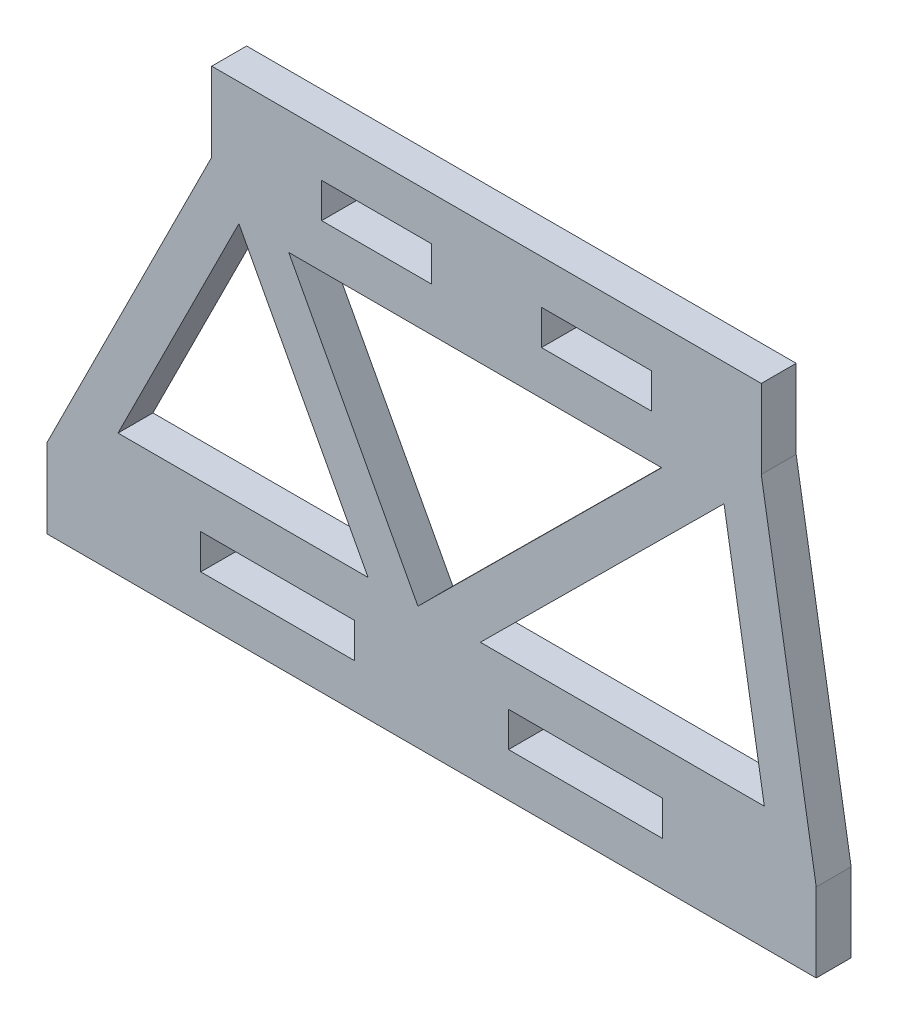
ISO-10303-21;
HEADER;
FILE_DESCRIPTION(('STEP AP214'),'2;1');
FILE_NAME('part.step','',(''),(''),'','','');
FILE_SCHEMA(('AUTOMOTIVE_DESIGN { 1 0 10303 214 1 1 1 1 }'));
ENDSEC;
DATA;
#1=APPLICATION_CONTEXT('core data for automotive mechanical design processes');
#2=APPLICATION_PROTOCOL_DEFINITION('international standard','automotive_design',2000,#1);
#3=PRODUCT_CONTEXT('',#1,'mechanical');
#4=PRODUCT('Part','Part','',(#3));
#5=PRODUCT_RELATED_PRODUCT_CATEGORY('part','',(#4));
#6=PRODUCT_DEFINITION_FORMATION('','',#4);
#7=PRODUCT_DEFINITION_CONTEXT('part definition',#1,'design');
#8=PRODUCT_DEFINITION('design','',#6,#7);
#9=PRODUCT_DEFINITION_SHAPE('','',#8);
#10=(LENGTH_UNIT() NAMED_UNIT(*) SI_UNIT(.MILLI.,.METRE.));
#11=(NAMED_UNIT(*) PLANE_ANGLE_UNIT() SI_UNIT($,.RADIAN.));
#12=(NAMED_UNIT(*) SI_UNIT($,.STERADIAN.) SOLID_ANGLE_UNIT());
#13=UNCERTAINTY_MEASURE_WITH_UNIT(LENGTH_MEASURE(1.E-05),#10,'distance_accuracy_value','');
#14=(GEOMETRIC_REPRESENTATION_CONTEXT(3) GLOBAL_UNCERTAINTY_ASSIGNED_CONTEXT((#13)) GLOBAL_UNIT_ASSIGNED_CONTEXT((#10,
#11,#12)) REPRESENTATION_CONTEXT('',''));
#15=CARTESIAN_POINT('',(0.,0.,0.));
#16=DIRECTION('',(0.,0.,1.));
#17=DIRECTION('',(1.,0.,0.));
#18=AXIS2_PLACEMENT_3D('',#15,#16,#17);
#19=CARTESIAN_POINT('',(0.,0.,3.175));
#20=DIRECTION('',(0.,0.,1.));
#21=DIRECTION('',(1.,0.,0.));
#22=AXIS2_PLACEMENT_3D('',#19,#20,#21);
#23=PLANE('',#22);
#24=DIRECTION('',(0.,-1.,0.));
#25=VECTOR('',#24,1.);
#26=CARTESIAN_POINT('',(0.,0.,3.175));
#27=LINE('',#26,#25);
#28=CARTESIAN_POINT('',(0.,0.,3.175));
#29=VERTEX_POINT('',#28);
#30=CARTESIAN_POINT('',(0.,-7.17499999999999,3.175));
#31=VERTEX_POINT('',#30);
#32=EDGE_CURVE('E452',#29,#31,#27,.T.);
#33=ORIENTED_EDGE('',*,*,#32,.T.);
#34=DIRECTION('',(1.,0.,0.));
#35=VECTOR('',#34,1.);
#36=CARTESIAN_POINT('',(0.,-7.17499999999999,3.175));
#37=LINE('',#36,#35);
#38=CARTESIAN_POINT('',(70.,-7.17499999999999,3.175));
#39=VERTEX_POINT('',#38);
#40=EDGE_CURVE('E455',#31,#39,#37,.T.);
#41=ORIENTED_EDGE('',*,*,#40,.T.);
#42=DIRECTION('',(0.,1.,0.));
#43=VECTOR('',#42,1.);
#44=CARTESIAN_POINT('',(70.,-7.17499999999999,3.175));
#45=LINE('',#44,#43);
#46=CARTESIAN_POINT('',(70.,0.,3.175));
#47=VERTEX_POINT('',#46);
#48=EDGE_CURVE('E458',#39,#47,#45,.T.);
#49=ORIENTED_EDGE('',*,*,#48,.T.);
#50=DIRECTION('',(-0.164398987305357,0.986393923832144,0.));
#51=VECTOR('',#50,1.);
#52=CARTESIAN_POINT('',(65.,30.,3.175));
#53=LINE('',#52,#51);
#54=CARTESIAN_POINT('',(65.,30.,3.175));
#55=VERTEX_POINT('',#54);
#56=EDGE_CURVE('E460',#47,#55,#53,.T.);
#57=ORIENTED_EDGE('',*,*,#56,.T.);
#58=DIRECTION('',(0.,1.,0.));
#59=VECTOR('',#58,1.);
#60=CARTESIAN_POINT('',(65.,37.175,3.175));
#61=LINE('',#60,#59);
#62=CARTESIAN_POINT('',(65.,37.175,3.175));
#63=VERTEX_POINT('',#62);
#64=EDGE_CURVE('E462',#55,#63,#61,.T.);
#65=ORIENTED_EDGE('',*,*,#64,.T.);
#66=DIRECTION('',(-1.,0.,0.));
#67=VECTOR('',#66,1.);
#68=CARTESIAN_POINT('',(15.,37.175,3.175));
#69=LINE('',#68,#67);
#70=CARTESIAN_POINT('',(15.,37.175,3.175));
#71=VERTEX_POINT('',#70);
#72=EDGE_CURVE('E464',#63,#71,#69,.T.);
#73=ORIENTED_EDGE('',*,*,#72,.T.);
#74=DIRECTION('',(0.,-1.,0.));
#75=VECTOR('',#74,1.);
#76=CARTESIAN_POINT('',(15.,30.,3.175));
#77=LINE('',#76,#75);
#78=CARTESIAN_POINT('',(15.,30.,3.175));
#79=VERTEX_POINT('',#78);
#80=EDGE_CURVE('E466',#71,#79,#77,.T.);
#81=ORIENTED_EDGE('',*,*,#80,.T.);
#82=DIRECTION('',(-0.447213595499958,-0.894427190999916,0.));
#83=VECTOR('',#82,1.);
#84=CARTESIAN_POINT('',(15.,30.,3.175));
#85=LINE('',#84,#83);
#86=EDGE_CURVE('E468',#79,#29,#85,.T.);
#87=ORIENTED_EDGE('',*,*,#86,.T.);
#88=EDGE_LOOP('',(#33,#41,#49,#57,#65,#73,#81,#87));
#89=FACE_BOUND('',#88,.T.);
#90=DIRECTION('',(0.,1.,0.));
#91=VECTOR('',#90,1.);
#92=CARTESIAN_POINT('',(35.,33.175,3.175));
#93=LINE('',#92,#91);
#94=CARTESIAN_POINT('',(35.,30.,3.175));
#95=VERTEX_POINT('',#94);
#96=CARTESIAN_POINT('',(35.,33.175,3.175));
#97=VERTEX_POINT('',#96);
#98=EDGE_CURVE('E423',#95,#97,#93,.T.);
#99=ORIENTED_EDGE('',*,*,#98,.F.);
#100=DIRECTION('',(1.,0.,0.));
#101=VECTOR('',#100,1.);
#102=CARTESIAN_POINT('',(25.,30.,3.175));
#103=LINE('',#102,#101);
#104=CARTESIAN_POINT('',(25.,30.,3.175));
#105=VERTEX_POINT('',#104);
#106=EDGE_CURVE('E421',#105,#95,#103,.T.);
#107=ORIENTED_EDGE('',*,*,#106,.F.);
#108=DIRECTION('',(0.,-1.,0.));
#109=VECTOR('',#108,1.);
#110=CARTESIAN_POINT('',(25.,30.,3.175));
#111=LINE('',#110,#109);
#112=CARTESIAN_POINT('',(25.,33.175,3.175));
#113=VERTEX_POINT('',#112);
#114=EDGE_CURVE('E429',#113,#105,#111,.T.);
#115=ORIENTED_EDGE('',*,*,#114,.F.);
#116=DIRECTION('',(-1.,0.,0.));
#117=VECTOR('',#116,1.);
#118=CARTESIAN_POINT('',(25.,33.175,3.175));
#119=LINE('',#118,#117);
#120=EDGE_CURVE('E426',#97,#113,#119,.T.);
#121=ORIENTED_EDGE('',*,*,#120,.F.);
#122=EDGE_LOOP('',(#99,#107,#115,#121));
#123=FACE_BOUND('',#122,.T.);
#124=DIRECTION('',(0.,-1.,0.));
#125=VECTOR('',#124,1.);
#126=CARTESIAN_POINT('',(14.,1.95522954975216E-13,3.175));
#127=LINE('',#126,#125);
#128=CARTESIAN_POINT('',(14.,1.95522954975216E-13,3.175));
#129=VERTEX_POINT('',#128);
#130=CARTESIAN_POINT('',(14.,-3.1749999999998,3.175));
#131=VERTEX_POINT('',#130);
#132=EDGE_CURVE('E392',#129,#131,#127,.T.);
#133=ORIENTED_EDGE('',*,*,#132,.F.);
#134=DIRECTION('',(-1.,0.,0.));
#135=VECTOR('',#134,1.);
#136=CARTESIAN_POINT('',(28.,3.90891042079233E-13,3.175));
#137=LINE('',#136,#135);
#138=CARTESIAN_POINT('',(28.,3.90891042079233E-13,3.175));
#139=VERTEX_POINT('',#138);
#140=EDGE_CURVE('E390',#139,#129,#137,.T.);
#141=ORIENTED_EDGE('',*,*,#140,.F.);
#142=DIRECTION('',(0.,1.,0.));
#143=VECTOR('',#142,1.);
#144=CARTESIAN_POINT('',(28.,-3.17499999999961,3.175));
#145=LINE('',#144,#143);
#146=CARTESIAN_POINT('',(28.,-3.17499999999961,3.175));
#147=VERTEX_POINT('',#146);
#148=EDGE_CURVE('E398',#147,#139,#145,.T.);
#149=ORIENTED_EDGE('',*,*,#148,.F.);
#150=DIRECTION('',(1.,0.,0.));
#151=VECTOR('',#150,1.);
#152=CARTESIAN_POINT('',(14.,-3.1749999999998,3.175));
#153=LINE('',#152,#151);
#154=EDGE_CURVE('E395',#131,#147,#153,.T.);
#155=ORIENTED_EDGE('',*,*,#154,.F.);
#156=EDGE_LOOP('',(#133,#141,#149,#155));
#157=FACE_BOUND('',#156,.T.);
#158=DIRECTION('',(0.,-1.,0.));
#159=VECTOR('',#158,1.);
#160=CARTESIAN_POINT('',(42.,5.86568864925647E-13,3.175));
#161=LINE('',#160,#159);
#162=CARTESIAN_POINT('',(42.,5.86568864925647E-13,3.175));
#163=VERTEX_POINT('',#162);
#164=CARTESIAN_POINT('',(42.,-3.17499999999941,3.175));
#165=VERTEX_POINT('',#164);
#166=EDGE_CURVE('E361',#163,#165,#161,.T.);
#167=ORIENTED_EDGE('',*,*,#166,.F.);
#168=DIRECTION('',(-1.,0.,0.));
#169=VECTOR('',#168,1.);
#170=CARTESIAN_POINT('',(56.,4.03188974282269E-13,3.175));
#171=LINE('',#170,#169);
#172=CARTESIAN_POINT('',(56.,4.03188974282269E-13,3.175));
#173=VERTEX_POINT('',#172);
#174=EDGE_CURVE('E359',#173,#163,#171,.T.);
#175=ORIENTED_EDGE('',*,*,#174,.F.);
#176=DIRECTION('',(0.,1.,0.));
#177=VECTOR('',#176,1.);
#178=CARTESIAN_POINT('',(56.,-3.1749999999996,3.175));
#179=LINE('',#178,#177);
#180=CARTESIAN_POINT('',(56.,-3.1749999999996,3.175));
#181=VERTEX_POINT('',#180);
#182=EDGE_CURVE('E367',#181,#173,#179,.T.);
#183=ORIENTED_EDGE('',*,*,#182,.F.);
#184=DIRECTION('',(1.,0.,0.));
#185=VECTOR('',#184,1.);
#186=CARTESIAN_POINT('',(42.,-3.17499999999941,3.175));
#187=LINE('',#186,#185);
#188=EDGE_CURVE('E364',#165,#181,#187,.T.);
#189=ORIENTED_EDGE('',*,*,#188,.F.);
#190=EDGE_LOOP('',(#167,#175,#183,#189));
#191=FACE_BOUND('',#190,.T.);
#192=DIRECTION('',(0.,1.,0.));
#193=VECTOR('',#192,1.);
#194=CARTESIAN_POINT('',(55.,33.175,3.175));
#195=LINE('',#194,#193);
#196=CARTESIAN_POINT('',(55.,30.,3.175));
#197=VERTEX_POINT('',#196);
#198=CARTESIAN_POINT('',(55.,33.175,3.175));
#199=VERTEX_POINT('',#198);
#200=EDGE_CURVE('E330',#197,#199,#195,.T.);
#201=ORIENTED_EDGE('',*,*,#200,.F.);
#202=DIRECTION('',(1.,0.,0.));
#203=VECTOR('',#202,1.);
#204=CARTESIAN_POINT('',(45.,30.,3.175));
#205=LINE('',#204,#203);
#206=CARTESIAN_POINT('',(45.,30.,3.175));
#207=VERTEX_POINT('',#206);
#208=EDGE_CURVE('E328',#207,#197,#205,.T.);
#209=ORIENTED_EDGE('',*,*,#208,.F.);
#210=DIRECTION('',(0.,-1.,0.));
#211=VECTOR('',#210,1.);
#212=CARTESIAN_POINT('',(45.,30.,3.175));
#213=LINE('',#212,#211);
#214=CARTESIAN_POINT('',(45.,33.175,3.175));
#215=VERTEX_POINT('',#214);
#216=EDGE_CURVE('E336',#215,#207,#213,.T.);
#217=ORIENTED_EDGE('',*,*,#216,.F.);
#218=DIRECTION('',(-1.,0.,0.));
#219=VECTOR('',#218,1.);
#220=CARTESIAN_POINT('',(45.,33.175,3.175));
#221=LINE('',#220,#219);
#222=EDGE_CURVE('E333',#199,#215,#221,.T.);
#223=ORIENTED_EDGE('',*,*,#222,.F.);
#224=EDGE_LOOP('',(#201,#209,#217,#223));
#225=FACE_BOUND('',#224,.T.);
#226=DIRECTION('',(1.,0.,0.));
#227=VECTOR('',#226,1.);
#228=CARTESIAN_POINT('',(65.2781583131345,4.0000000000004,3.175));
#229=LINE('',#228,#227);
#230=CARTESIAN_POINT('',(39.4403763011618,4.0000000000004,3.175));
#231=VERTEX_POINT('',#230);
#232=CARTESIAN_POINT('',(65.2781583131344,4.00000000000041,3.175));
#233=VERTEX_POINT('',#232);
#234=EDGE_CURVE('E303',#231,#233,#229,.T.);
#235=ORIENTED_EDGE('',*,*,#234,.F.);
#236=DIRECTION('',(-0.709840729579017,-0.704362221183624,0.));
#237=VECTOR('',#236,1.);
#238=CARTESIAN_POINT('',(39.4403763011618,4.0000000000004,3.175));
#239=LINE('',#238,#237);
#240=CARTESIAN_POINT('',(61.6114916464679,26.,3.175));
#241=VERTEX_POINT('',#240);
#242=EDGE_CURVE('E305',#241,#231,#239,.T.);
#243=ORIENTED_EDGE('',*,*,#242,.F.);
#244=DIRECTION('',(-0.164398987305357,0.986393923832144,0.));
#245=VECTOR('',#244,1.);
#246=CARTESIAN_POINT('',(61.6114916464679,26.,3.175));
#247=LINE('',#246,#245);
#248=EDGE_CURVE('E324',#233,#241,#247,.T.);
#249=ORIENTED_EDGE('',*,*,#248,.F.);
#250=EDGE_LOOP('',(#235,#243,#249));
#251=FACE_BOUND('',#250,.T.);
#252=DIRECTION('',(-0.447213595499958,-0.894427190999916,0.));
#253=VECTOR('',#252,1.);
#254=CARTESIAN_POINT('',(17.4721359549996,26.,3.175));
#255=LINE('',#254,#253);
#256=CARTESIAN_POINT('',(17.4721359549996,26.,3.175));
#257=VERTEX_POINT('',#256);
#258=CARTESIAN_POINT('',(6.47213595499978,4.0000000000004,3.175));
#259=VERTEX_POINT('',#258);
#260=EDGE_CURVE('E58',#257,#259,#255,.T.);
#261=ORIENTED_EDGE('',*,*,#260,.F.);
#262=DIRECTION('',(-0.471240107527781,0.882004966571734,0.));
#263=VECTOR('',#262,1.);
#264=CARTESIAN_POINT('',(29.2263581629624,4.0000000000004,3.175));
#265=LINE('',#264,#263);
#266=CARTESIAN_POINT('',(29.2263581629624,4.0000000000004,3.175));
#267=VERTEX_POINT('',#266);
#268=EDGE_CURVE('E254',#267,#257,#265,.T.);
#269=ORIENTED_EDGE('',*,*,#268,.F.);
#270=DIRECTION('',(1.,0.,0.));
#271=VECTOR('',#270,1.);
#272=CARTESIAN_POINT('',(6.47213595499978,4.0000000000004,3.175));
#273=LINE('',#272,#271);
#274=EDGE_CURVE('E264',#259,#267,#273,.T.);
#275=ORIENTED_EDGE('',*,*,#274,.F.);
#276=EDGE_LOOP('',(#261,#269,#275));
#277=FACE_BOUND('',#276,.T.);
#278=DIRECTION('',(0.471240107527781,-0.882004966571734,0.));
#279=VECTOR('',#278,1.);
#280=CARTESIAN_POINT('',(33.7614800178286,4.0000000000004,3.175));
#281=LINE('',#280,#279);
#282=CARTESIAN_POINT('',(22.0072578098658,26.,3.175));
#283=VERTEX_POINT('',#282);
#284=CARTESIAN_POINT('',(33.7614800178286,4.0000000000004,3.175));
#285=VERTEX_POINT('',#284);
#286=EDGE_CURVE('E50',#283,#285,#281,.T.);
#287=ORIENTED_EDGE('',*,*,#286,.F.);
#288=DIRECTION('',(-1.,0.,0.));
#289=VECTOR('',#288,1.);
#290=CARTESIAN_POINT('',(22.0072578098658,26.,3.175));
#291=LINE('',#290,#289);
#292=CARTESIAN_POINT('',(55.9325953631347,26.,3.175));
#293=VERTEX_POINT('',#292);
#294=EDGE_CURVE('E281',#293,#283,#291,.T.);
#295=ORIENTED_EDGE('',*,*,#294,.F.);
#296=DIRECTION('',(0.709840729579017,0.704362221183624,0.));
#297=VECTOR('',#296,1.);
#298=CARTESIAN_POINT('',(55.9325953631347,26.,3.175));
#299=LINE('',#298,#297);
#300=EDGE_CURVE('E300',#285,#293,#299,.T.);
#301=ORIENTED_EDGE('',*,*,#300,.F.);
#302=EDGE_LOOP('',(#287,#295,#301));
#303=FACE_BOUND('',#302,.T.);
#304=ADVANCED_FACE('F35',(#89,#123,#157,#191,#225,#251,#277,#303),#23,.T.);
#305=CARTESIAN_POINT('',(0.,0.,0.));
#306=DIRECTION('',(0.,0.,1.));
#307=DIRECTION('',(1.,0.,0.));
#308=AXIS2_PLACEMENT_3D('',#305,#306,#307);
#309=PLANE('',#308);
#310=DIRECTION('',(-0.471240107527781,0.882004966571734,0.));
#311=VECTOR('',#310,1.);
#312=CARTESIAN_POINT('',(29.2263581629624,4.0000000000004,0.));
#313=LINE('',#312,#311);
#314=CARTESIAN_POINT('',(29.2263581629624,4.0000000000004,0.));
#315=VERTEX_POINT('',#314);
#316=CARTESIAN_POINT('',(17.4721359549996,26.,0.));
#317=VERTEX_POINT('',#316);
#318=EDGE_CURVE('E256',#315,#317,#313,.T.);
#319=ORIENTED_EDGE('',*,*,#318,.T.);
#320=DIRECTION('',(-0.447213595499958,-0.894427190999916,0.));
#321=VECTOR('',#320,1.);
#322=CARTESIAN_POINT('',(17.4721359549996,26.,0.));
#323=LINE('',#322,#321);
#324=CARTESIAN_POINT('',(6.47213595499978,4.0000000000004,0.));
#325=VERTEX_POINT('',#324);
#326=EDGE_CURVE('E271',#317,#325,#323,.T.);
#327=ORIENTED_EDGE('',*,*,#326,.T.);
#328=DIRECTION('',(1.,0.,0.));
#329=VECTOR('',#328,1.);
#330=CARTESIAN_POINT('',(6.47213595499978,4.0000000000004,0.));
#331=LINE('',#330,#329);
#332=EDGE_CURVE('E261',#325,#315,#331,.T.);
#333=ORIENTED_EDGE('',*,*,#332,.T.);
#334=EDGE_LOOP('',(#319,#327,#333));
#335=FACE_BOUND('',#334,.T.);
#336=DIRECTION('',(1.,0.,0.));
#337=VECTOR('',#336,1.);
#338=CARTESIAN_POINT('',(45.,30.,0.));
#339=LINE('',#338,#337);
#340=CARTESIAN_POINT('',(45.,30.,0.));
#341=VERTEX_POINT('',#340);
#342=CARTESIAN_POINT('',(55.,30.,0.));
#343=VERTEX_POINT('',#342);
#344=EDGE_CURVE('E327',#341,#343,#339,.T.);
#345=ORIENTED_EDGE('',*,*,#344,.T.);
#346=DIRECTION('',(0.,1.,0.));
#347=VECTOR('',#346,1.);
#348=CARTESIAN_POINT('',(55.,33.175,0.));
#349=LINE('',#348,#347);
#350=CARTESIAN_POINT('',(55.,33.175,0.));
#351=VERTEX_POINT('',#350);
#352=EDGE_CURVE('E341',#343,#351,#349,.T.);
#353=ORIENTED_EDGE('',*,*,#352,.T.);
#354=DIRECTION('',(-1.,0.,0.));
#355=VECTOR('',#354,1.);
#356=CARTESIAN_POINT('',(45.,33.175,0.));
#357=LINE('',#356,#355);
#358=CARTESIAN_POINT('',(45.,33.175,0.));
#359=VERTEX_POINT('',#358);
#360=EDGE_CURVE('E344',#351,#359,#357,.T.);
#361=ORIENTED_EDGE('',*,*,#360,.T.);
#362=DIRECTION('',(0.,-1.,0.));
#363=VECTOR('',#362,1.);
#364=CARTESIAN_POINT('',(45.,30.,0.));
#365=LINE('',#364,#363);
#366=EDGE_CURVE('E331',#359,#341,#365,.T.);
#367=ORIENTED_EDGE('',*,*,#366,.T.);
#368=EDGE_LOOP('',(#345,#353,#361,#367));
#369=FACE_BOUND('',#368,.T.);
#370=DIRECTION('',(-1.,0.,0.));
#371=VECTOR('',#370,1.);
#372=CARTESIAN_POINT('',(28.,3.90891042079233E-13,0.));
#373=LINE('',#372,#371);
#374=CARTESIAN_POINT('',(28.,3.90891038659408E-13,0.));
#375=VERTEX_POINT('',#374);
#376=CARTESIAN_POINT('',(14.,1.95522954975216E-13,0.));
#377=VERTEX_POINT('',#376);
#378=EDGE_CURVE('E389',#375,#377,#373,.T.);
#379=ORIENTED_EDGE('',*,*,#378,.T.);
#380=DIRECTION('',(0.,-1.,0.));
#381=VECTOR('',#380,1.);
#382=CARTESIAN_POINT('',(14.,1.95522954975216E-13,0.));
#383=LINE('',#382,#381);
#384=CARTESIAN_POINT('',(14.,-3.1749999999998,0.));
#385=VERTEX_POINT('',#384);
#386=EDGE_CURVE('E403',#377,#385,#383,.T.);
#387=ORIENTED_EDGE('',*,*,#386,.T.);
#388=DIRECTION('',(1.,0.,0.));
#389=VECTOR('',#388,1.);
#390=CARTESIAN_POINT('',(14.,-3.1749999999998,0.));
#391=LINE('',#390,#389);
#392=CARTESIAN_POINT('',(28.,-3.17499999999961,0.));
#393=VERTEX_POINT('',#392);
#394=EDGE_CURVE('E406',#385,#393,#391,.T.);
#395=ORIENTED_EDGE('',*,*,#394,.T.);
#396=DIRECTION('',(0.,1.,0.));
#397=VECTOR('',#396,1.);
#398=CARTESIAN_POINT('',(28.,-3.17499999999961,0.));
#399=LINE('',#398,#397);
#400=EDGE_CURVE('E393',#393,#375,#399,.T.);
#401=ORIENTED_EDGE('',*,*,#400,.T.);
#402=EDGE_LOOP('',(#379,#387,#395,#401));
#403=FACE_BOUND('',#402,.T.);
#404=DIRECTION('',(0.,-1.,0.));
#405=VECTOR('',#404,1.);
#406=CARTESIAN_POINT('',(0.,0.,0.));
#407=LINE('',#406,#405);
#408=CARTESIAN_POINT('',(0.,0.,0.));
#409=VERTEX_POINT('',#408);
#410=CARTESIAN_POINT('',(0.,-7.17499999999999,0.));
#411=VERTEX_POINT('',#410);
#412=EDGE_CURVE('E451',#409,#411,#407,.T.);
#413=ORIENTED_EDGE('',*,*,#412,.F.);
#414=DIRECTION('',(-0.447213595499958,-0.894427190999916,0.));
#415=VECTOR('',#414,1.);
#416=CARTESIAN_POINT('',(15.,30.,0.));
#417=LINE('',#416,#415);
#418=CARTESIAN_POINT('',(15.,30.,0.));
#419=VERTEX_POINT('',#418);
#420=EDGE_CURVE('E456',#419,#409,#417,.T.);
#421=ORIENTED_EDGE('',*,*,#420,.F.);
#422=DIRECTION('',(0.,-1.,0.));
#423=VECTOR('',#422,1.);
#424=CARTESIAN_POINT('',(15.,30.,0.));
#425=LINE('',#424,#423);
#426=CARTESIAN_POINT('',(15.,37.175,0.));
#427=VERTEX_POINT('',#426);
#428=EDGE_CURVE('E483',#427,#419,#425,.T.);
#429=ORIENTED_EDGE('',*,*,#428,.F.);
#430=DIRECTION('',(-1.,0.,0.));
#431=VECTOR('',#430,1.);
#432=CARTESIAN_POINT('',(15.,37.175,0.));
#433=LINE('',#432,#431);
#434=CARTESIAN_POINT('',(65.,37.175,0.));
#435=VERTEX_POINT('',#434);
#436=EDGE_CURVE('E481',#435,#427,#433,.T.);
#437=ORIENTED_EDGE('',*,*,#436,.F.);
#438=DIRECTION('',(0.,1.,0.));
#439=VECTOR('',#438,1.);
#440=CARTESIAN_POINT('',(65.,37.175,0.));
#441=LINE('',#440,#439);
#442=CARTESIAN_POINT('',(65.,30.,0.));
#443=VERTEX_POINT('',#442);
#444=EDGE_CURVE('E479',#443,#435,#441,.T.);
#445=ORIENTED_EDGE('',*,*,#444,.F.);
#446=DIRECTION('',(-0.164398987305357,0.986393923832144,0.));
#447=VECTOR('',#446,1.);
#448=CARTESIAN_POINT('',(65.,30.,0.));
#449=LINE('',#448,#447);
#450=CARTESIAN_POINT('',(70.,0.,0.));
#451=VERTEX_POINT('',#450);
#452=EDGE_CURVE('E477',#451,#443,#449,.T.);
#453=ORIENTED_EDGE('',*,*,#452,.F.);
#454=DIRECTION('',(0.,1.,0.));
#455=VECTOR('',#454,1.);
#456=CARTESIAN_POINT('',(70.,-7.17499999999999,0.));
#457=LINE('',#456,#455);
#458=CARTESIAN_POINT('',(70.,-7.17499999999999,0.));
#459=VERTEX_POINT('',#458);
#460=EDGE_CURVE('E475',#459,#451,#457,.T.);
#461=ORIENTED_EDGE('',*,*,#460,.F.);
#462=DIRECTION('',(1.,0.,0.));
#463=VECTOR('',#462,1.);
#464=CARTESIAN_POINT('',(0.,-7.17499999999999,0.));
#465=LINE('',#464,#463);
#466=EDGE_CURVE('E473',#411,#459,#465,.T.);
#467=ORIENTED_EDGE('',*,*,#466,.F.);
#468=EDGE_LOOP('',(#413,#421,#429,#437,#445,#453,#461,#467));
#469=FACE_BOUND('',#468,.T.);
#470=DIRECTION('',(1.,0.,0.));
#471=VECTOR('',#470,1.);
#472=CARTESIAN_POINT('',(25.,30.,0.));
#473=LINE('',#472,#471);
#474=CARTESIAN_POINT('',(25.,30.,0.));
#475=VERTEX_POINT('',#474);
#476=CARTESIAN_POINT('',(35.,30.,0.));
#477=VERTEX_POINT('',#476);
#478=EDGE_CURVE('E420',#475,#477,#473,.T.);
#479=ORIENTED_EDGE('',*,*,#478,.T.);
#480=DIRECTION('',(0.,1.,0.));
#481=VECTOR('',#480,1.);
#482=CARTESIAN_POINT('',(35.,33.175,0.));
#483=LINE('',#482,#481);
#484=CARTESIAN_POINT('',(35.,33.175,0.));
#485=VERTEX_POINT('',#484);
#486=EDGE_CURVE('E434',#477,#485,#483,.T.);
#487=ORIENTED_EDGE('',*,*,#486,.T.);
#488=DIRECTION('',(-1.,0.,0.));
#489=VECTOR('',#488,1.);
#490=CARTESIAN_POINT('',(25.,33.175,0.));
#491=LINE('',#490,#489);
#492=CARTESIAN_POINT('',(25.,33.175,0.));
#493=VERTEX_POINT('',#492);
#494=EDGE_CURVE('E437',#485,#493,#491,.T.);
#495=ORIENTED_EDGE('',*,*,#494,.T.);
#496=DIRECTION('',(0.,-1.,0.));
#497=VECTOR('',#496,1.);
#498=CARTESIAN_POINT('',(25.,30.,0.));
#499=LINE('',#498,#497);
#500=EDGE_CURVE('E424',#493,#475,#499,.T.);
#501=ORIENTED_EDGE('',*,*,#500,.T.);
#502=EDGE_LOOP('',(#479,#487,#495,#501));
#503=FACE_BOUND('',#502,.T.);
#504=DIRECTION('',(-1.,0.,0.));
#505=VECTOR('',#504,1.);
#506=CARTESIAN_POINT('',(56.,4.03188974282269E-13,0.));
#507=LINE('',#506,#505);
#508=CARTESIAN_POINT('',(56.,4.03188974493237E-13,0.));
#509=VERTEX_POINT('',#508);
#510=CARTESIAN_POINT('',(42.,5.86568864925647E-13,0.));
#511=VERTEX_POINT('',#510);
#512=EDGE_CURVE('E358',#509,#511,#507,.T.);
#513=ORIENTED_EDGE('',*,*,#512,.T.);
#514=DIRECTION('',(0.,-1.,0.));
#515=VECTOR('',#514,1.);
#516=CARTESIAN_POINT('',(42.,5.86568864925647E-13,0.));
#517=LINE('',#516,#515);
#518=CARTESIAN_POINT('',(42.,-3.17499999999941,0.));
#519=VERTEX_POINT('',#518);
#520=EDGE_CURVE('E372',#511,#519,#517,.T.);
#521=ORIENTED_EDGE('',*,*,#520,.T.);
#522=DIRECTION('',(1.,0.,0.));
#523=VECTOR('',#522,1.);
#524=CARTESIAN_POINT('',(42.,-3.17499999999941,0.));
#525=LINE('',#524,#523);
#526=CARTESIAN_POINT('',(56.,-3.1749999999996,0.));
#527=VERTEX_POINT('',#526);
#528=EDGE_CURVE('E375',#519,#527,#525,.T.);
#529=ORIENTED_EDGE('',*,*,#528,.T.);
#530=DIRECTION('',(0.,1.,0.));
#531=VECTOR('',#530,1.);
#532=CARTESIAN_POINT('',(56.,-3.1749999999996,0.));
#533=LINE('',#532,#531);
#534=EDGE_CURVE('E362',#527,#509,#533,.T.);
#535=ORIENTED_EDGE('',*,*,#534,.T.);
#536=EDGE_LOOP('',(#513,#521,#529,#535));
#537=FACE_BOUND('',#536,.T.);
#538=DIRECTION('',(-0.709840729579017,-0.704362221183624,0.));
#539=VECTOR('',#538,1.);
#540=CARTESIAN_POINT('',(39.4403763011618,4.0000000000004,0.));
#541=LINE('',#540,#539);
#542=CARTESIAN_POINT('',(61.6114916464678,26.,0.));
#543=VERTEX_POINT('',#542);
#544=CARTESIAN_POINT('',(39.4403763011618,4.0000000000004,0.));
#545=VERTEX_POINT('',#544);
#546=EDGE_CURVE('E308',#543,#545,#541,.T.);
#547=ORIENTED_EDGE('',*,*,#546,.T.);
#548=DIRECTION('',(1.,0.,0.));
#549=VECTOR('',#548,1.);
#550=CARTESIAN_POINT('',(65.2781583131345,4.0000000000004,0.));
#551=LINE('',#550,#549);
#552=CARTESIAN_POINT('',(65.2781583131345,4.0000000000004,0.));
#553=VERTEX_POINT('',#552);
#554=EDGE_CURVE('E311',#545,#553,#551,.T.);
#555=ORIENTED_EDGE('',*,*,#554,.T.);
#556=DIRECTION('',(-0.164398987305357,0.986393923832144,0.));
#557=VECTOR('',#556,1.);
#558=CARTESIAN_POINT('',(61.6114916464679,26.,0.));
#559=LINE('',#558,#557);
#560=EDGE_CURVE('E314',#553,#543,#559,.T.);
#561=ORIENTED_EDGE('',*,*,#560,.T.);
#562=EDGE_LOOP('',(#547,#555,#561));
#563=FACE_BOUND('',#562,.T.);
#564=DIRECTION('',(-1.,0.,0.));
#565=VECTOR('',#564,1.);
#566=CARTESIAN_POINT('',(22.0072578098658,26.,0.));
#567=LINE('',#566,#565);
#568=CARTESIAN_POINT('',(55.9325953631347,26.,0.));
#569=VERTEX_POINT('',#568);
#570=CARTESIAN_POINT('',(22.0072578098658,26.,0.));
#571=VERTEX_POINT('',#570);
#572=EDGE_CURVE('E284',#569,#571,#567,.T.);
#573=ORIENTED_EDGE('',*,*,#572,.T.);
#574=DIRECTION('',(0.471240107527781,-0.882004966571734,0.));
#575=VECTOR('',#574,1.);
#576=CARTESIAN_POINT('',(33.7614800178286,4.0000000000004,0.));
#577=LINE('',#576,#575);
#578=CARTESIAN_POINT('',(33.7614800178286,4.0000000000004,0.));
#579=VERTEX_POINT('',#578);
#580=EDGE_CURVE('E287',#571,#579,#577,.T.);
#581=ORIENTED_EDGE('',*,*,#580,.T.);
#582=DIRECTION('',(0.709840729579017,0.704362221183624,0.));
#583=VECTOR('',#582,1.);
#584=CARTESIAN_POINT('',(55.9325953631347,26.,0.));
#585=LINE('',#584,#583);
#586=EDGE_CURVE('E290',#579,#569,#585,.T.);
#587=ORIENTED_EDGE('',*,*,#586,.T.);
#588=EDGE_LOOP('',(#573,#581,#587));
#589=FACE_BOUND('',#588,.T.);
#590=ADVANCED_FACE('F513',(#335,#369,#403,#469,#503,#537,#563,#589),#309,.F.);
#591=CARTESIAN_POINT('',(0.,0.,3.175));
#592=DIRECTION('',(1.,0.,0.));
#593=DIRECTION('',(0.,1.,0.));
#594=AXIS2_PLACEMENT_3D('',#591,#592,#593);
#595=PLANE('',#594);
#596=ORIENTED_EDGE('',*,*,#412,.T.);
#597=DIRECTION('',(0.,0.,-1.));
#598=VECTOR('',#597,1.);
#599=CARTESIAN_POINT('',(0.,-7.17499999999999,3.175));
#600=LINE('',#599,#598);
#601=EDGE_CURVE('E11',#31,#411,#600,.T.);
#602=ORIENTED_EDGE('',*,*,#601,.F.);
#603=ORIENTED_EDGE('',*,*,#32,.F.);
#604=DIRECTION('',(0.,0.,-1.));
#605=VECTOR('',#604,1.);
#606=CARTESIAN_POINT('',(0.,0.,3.175));
#607=LINE('',#606,#605);
#608=EDGE_CURVE('E470',#29,#409,#607,.T.);
#609=ORIENTED_EDGE('',*,*,#608,.T.);
#610=EDGE_LOOP('',(#596,#602,#603,#609));
#611=FACE_BOUND('',#610,.T.);
#612=ADVANCED_FACE('F37',(#611),#595,.F.);
#613=CARTESIAN_POINT('',(0.,-7.17499999999999,3.175));
#614=DIRECTION('',(0.,1.,0.));
#615=DIRECTION('',(0.,0.,1.));
#616=AXIS2_PLACEMENT_3D('',#613,#614,#615);
#617=PLANE('',#616);
#618=ORIENTED_EDGE('',*,*,#466,.T.);
#619=DIRECTION('',(0.,0.,-1.));
#620=VECTOR('',#619,1.);
#621=CARTESIAN_POINT('',(70.,-7.17499999999999,3.175));
#622=LINE('',#621,#620);
#623=EDGE_CURVE('E43',#39,#459,#622,.T.);
#624=ORIENTED_EDGE('',*,*,#623,.F.);
#625=ORIENTED_EDGE('',*,*,#40,.F.);
#626=ORIENTED_EDGE('',*,*,#601,.T.);
#627=EDGE_LOOP('',(#618,#624,#625,#626));
#628=FACE_BOUND('',#627,.T.);
#629=ADVANCED_FACE('F531',(#628),#617,.F.);
#630=CARTESIAN_POINT('',(70.,-7.17499999999999,3.175));
#631=DIRECTION('',(-1.,0.,0.));
#632=DIRECTION('',(0.,0.,1.));
#633=AXIS2_PLACEMENT_3D('',#630,#631,#632);
#634=PLANE('',#633);
#635=ORIENTED_EDGE('',*,*,#460,.T.);
#636=DIRECTION('',(0.,0.,-1.));
#637=VECTOR('',#636,1.);
#638=CARTESIAN_POINT('',(70.,0.,3.175));
#639=LINE('',#638,#637);
#640=EDGE_CURVE('E500',#47,#451,#639,.T.);
#641=ORIENTED_EDGE('',*,*,#640,.F.);
#642=ORIENTED_EDGE('',*,*,#48,.F.);
#643=ORIENTED_EDGE('',*,*,#623,.T.);
#644=EDGE_LOOP('',(#635,#641,#642,#643));
#645=FACE_BOUND('',#644,.T.);
#646=ADVANCED_FACE('F507',(#645),#634,.F.);
#647=CARTESIAN_POINT('',(65.,30.,3.175));
#648=DIRECTION('',(-0.986393923832144,-0.164398987305357,0.));
#649=DIRECTION('',(0.164398987305357,-0.986393923832144,0.));
#650=AXIS2_PLACEMENT_3D('',#647,#648,#649);
#651=PLANE('',#650);
#652=ORIENTED_EDGE('',*,*,#452,.T.);
#653=DIRECTION('',(0.,0.,-1.));
#654=VECTOR('',#653,1.);
#655=CARTESIAN_POINT('',(65.,30.,3.175));
#656=LINE('',#655,#654);
#657=EDGE_CURVE('E497',#55,#443,#656,.T.);
#658=ORIENTED_EDGE('',*,*,#657,.F.);
#659=ORIENTED_EDGE('',*,*,#56,.F.);
#660=ORIENTED_EDGE('',*,*,#640,.T.);
#661=EDGE_LOOP('',(#652,#658,#659,#660));
#662=FACE_BOUND('',#661,.T.);
#663=ADVANCED_FACE('F519',(#662),#651,.F.);
#664=CARTESIAN_POINT('',(65.,37.175,3.175));
#665=DIRECTION('',(-1.,0.,0.));
#666=DIRECTION('',(0.,0.,1.));
#667=AXIS2_PLACEMENT_3D('',#664,#665,#666);
#668=PLANE('',#667);
#669=ORIENTED_EDGE('',*,*,#444,.T.);
#670=DIRECTION('',(0.,0.,-1.));
#671=VECTOR('',#670,1.);
#672=CARTESIAN_POINT('',(65.,37.175,3.175));
#673=LINE('',#672,#671);
#674=EDGE_CURVE('E494',#63,#435,#673,.T.);
#675=ORIENTED_EDGE('',*,*,#674,.F.);
#676=ORIENTED_EDGE('',*,*,#64,.F.);
#677=ORIENTED_EDGE('',*,*,#657,.T.);
#678=EDGE_LOOP('',(#669,#675,#676,#677));
#679=FACE_BOUND('',#678,.T.);
#680=ADVANCED_FACE('F523',(#679),#668,.F.);
#681=CARTESIAN_POINT('',(15.,37.175,3.175));
#682=DIRECTION('',(0.,-1.,0.));
#683=DIRECTION('',(0.,0.,-1.));
#684=AXIS2_PLACEMENT_3D('',#681,#682,#683);
#685=PLANE('',#684);
#686=ORIENTED_EDGE('',*,*,#436,.T.);
#687=DIRECTION('',(0.,0.,-1.));
#688=VECTOR('',#687,1.);
#689=CARTESIAN_POINT('',(15.,37.175,3.175));
#690=LINE('',#689,#688);
#691=EDGE_CURVE('E491',#71,#427,#690,.T.);
#692=ORIENTED_EDGE('',*,*,#691,.F.);
#693=ORIENTED_EDGE('',*,*,#72,.F.);
#694=ORIENTED_EDGE('',*,*,#674,.T.);
#695=EDGE_LOOP('',(#686,#692,#693,#694));
#696=FACE_BOUND('',#695,.T.);
#697=ADVANCED_FACE('F544',(#696),#685,.F.);
#698=CARTESIAN_POINT('',(15.,30.,3.175));
#699=DIRECTION('',(1.,0.,0.));
#700=DIRECTION('',(0.,0.,-1.));
#701=AXIS2_PLACEMENT_3D('',#698,#699,#700);
#702=PLANE('',#701);
#703=ORIENTED_EDGE('',*,*,#428,.T.);
#704=DIRECTION('',(0.,0.,-1.));
#705=VECTOR('',#704,1.);
#706=CARTESIAN_POINT('',(15.,30.,3.175));
#707=LINE('',#706,#705);
#708=EDGE_CURVE('E488',#79,#419,#707,.T.);
#709=ORIENTED_EDGE('',*,*,#708,.F.);
#710=ORIENTED_EDGE('',*,*,#80,.F.);
#711=ORIENTED_EDGE('',*,*,#691,.T.);
#712=EDGE_LOOP('',(#703,#709,#710,#711));
#713=FACE_BOUND('',#712,.T.);
#714=ADVANCED_FACE('F542',(#713),#702,.F.);
#715=CARTESIAN_POINT('',(15.,30.,3.175));
#716=DIRECTION('',(0.894427190999916,-0.447213595499958,0.));
#717=DIRECTION('',(0.447213595499959,0.894427190999916,0.));
#718=AXIS2_PLACEMENT_3D('',#715,#716,#717);
#719=PLANE('',#718);
#720=ORIENTED_EDGE('',*,*,#420,.T.);
#721=ORIENTED_EDGE('',*,*,#608,.F.);
#722=ORIENTED_EDGE('',*,*,#86,.F.);
#723=ORIENTED_EDGE('',*,*,#708,.T.);
#724=EDGE_LOOP('',(#720,#721,#722,#723));
#725=FACE_BOUND('',#724,.T.);
#726=ADVANCED_FACE('F537',(#725),#719,.F.);
#727=CARTESIAN_POINT('',(25.,30.,3.175));
#728=DIRECTION('',(0.,1.,0.));
#729=DIRECTION('',(0.,0.,1.));
#730=AXIS2_PLACEMENT_3D('',#727,#728,#729);
#731=PLANE('',#730);
#732=ORIENTED_EDGE('',*,*,#478,.F.);
#733=DIRECTION('',(0.,0.,-1.));
#734=VECTOR('',#733,1.);
#735=CARTESIAN_POINT('',(25.,30.,3.175));
#736=LINE('',#735,#734);
#737=EDGE_CURVE('E431',#105,#475,#736,.T.);
#738=ORIENTED_EDGE('',*,*,#737,.F.);
#739=ORIENTED_EDGE('',*,*,#106,.T.);
#740=DIRECTION('',(0.,0.,-1.));
#741=VECTOR('',#740,1.);
#742=CARTESIAN_POINT('',(35.,30.,3.175));
#743=LINE('',#742,#741);
#744=EDGE_CURVE('E448',#95,#477,#743,.T.);
#745=ORIENTED_EDGE('',*,*,#744,.T.);
#746=EDGE_LOOP('',(#732,#738,#739,#745));
#747=FACE_BOUND('',#746,.T.);
#748=ADVANCED_FACE('F561',(#747),#731,.T.);
#749=CARTESIAN_POINT('',(35.,33.175,3.175));
#750=DIRECTION('',(-1.,0.,0.));
#751=DIRECTION('',(0.,0.,1.));
#752=AXIS2_PLACEMENT_3D('',#749,#750,#751);
#753=PLANE('',#752);
#754=ORIENTED_EDGE('',*,*,#486,.F.);
#755=ORIENTED_EDGE('',*,*,#744,.F.);
#756=ORIENTED_EDGE('',*,*,#98,.T.);
#757=DIRECTION('',(0.,0.,-1.));
#758=VECTOR('',#757,1.);
#759=CARTESIAN_POINT('',(35.,33.175,3.175));
#760=LINE('',#759,#758);
#761=EDGE_CURVE('E446',#97,#485,#760,.T.);
#762=ORIENTED_EDGE('',*,*,#761,.T.);
#763=EDGE_LOOP('',(#754,#755,#756,#762));
#764=FACE_BOUND('',#763,.T.);
#765=ADVANCED_FACE('F568',(#764),#753,.T.);
#766=CARTESIAN_POINT('',(25.,33.175,3.175));
#767=DIRECTION('',(0.,-1.,0.));
#768=DIRECTION('',(1.,0.,0.));
#769=AXIS2_PLACEMENT_3D('',#766,#767,#768);
#770=PLANE('',#769);
#771=ORIENTED_EDGE('',*,*,#494,.F.);
#772=ORIENTED_EDGE('',*,*,#761,.F.);
#773=ORIENTED_EDGE('',*,*,#120,.T.);
#774=DIRECTION('',(0.,0.,-1.));
#775=VECTOR('',#774,1.);
#776=CARTESIAN_POINT('',(25.,33.175,3.175));
#777=LINE('',#776,#775);
#778=EDGE_CURVE('E444',#113,#493,#777,.T.);
#779=ORIENTED_EDGE('',*,*,#778,.T.);
#780=EDGE_LOOP('',(#771,#772,#773,#779));
#781=FACE_BOUND('',#780,.T.);
#782=ADVANCED_FACE('F573',(#781),#770,.T.);
#783=CARTESIAN_POINT('',(25.,30.,3.175));
#784=DIRECTION('',(1.,0.,0.));
#785=DIRECTION('',(0.,0.,-1.));
#786=AXIS2_PLACEMENT_3D('',#783,#784,#785);
#787=PLANE('',#786);
#788=ORIENTED_EDGE('',*,*,#500,.F.);
#789=ORIENTED_EDGE('',*,*,#778,.F.);
#790=ORIENTED_EDGE('',*,*,#114,.T.);
#791=ORIENTED_EDGE('',*,*,#737,.T.);
#792=EDGE_LOOP('',(#788,#789,#790,#791));
#793=FACE_BOUND('',#792,.T.);
#794=ADVANCED_FACE('F580',(#793),#787,.T.);
#795=CARTESIAN_POINT('',(28.,3.90891042079233E-13,3.175));
#796=DIRECTION('',(0.,-1.,0.));
#797=DIRECTION('',(1.,0.,0.));
#798=AXIS2_PLACEMENT_3D('',#795,#796,#797);
#799=PLANE('',#798);
#800=ORIENTED_EDGE('',*,*,#378,.F.);
#801=DIRECTION('',(0.,0.,-1.));
#802=VECTOR('',#801,1.);
#803=CARTESIAN_POINT('',(28.,3.90891042079233E-13,3.175));
#804=LINE('',#803,#802);
#805=EDGE_CURVE('E400',#139,#375,#804,.T.);
#806=ORIENTED_EDGE('',*,*,#805,.F.);
#807=ORIENTED_EDGE('',*,*,#140,.T.);
#808=DIRECTION('',(0.,0.,-1.));
#809=VECTOR('',#808,1.);
#810=CARTESIAN_POINT('',(14.,1.95522954975216E-13,3.175));
#811=LINE('',#810,#809);
#812=EDGE_CURVE('E417',#129,#377,#811,.T.);
#813=ORIENTED_EDGE('',*,*,#812,.T.);
#814=EDGE_LOOP('',(#800,#806,#807,#813));
#815=FACE_BOUND('',#814,.T.);
#816=ADVANCED_FACE('F666',(#815),#799,.T.);
#817=CARTESIAN_POINT('',(14.,1.95522954975216E-13,3.175));
#818=DIRECTION('',(1.,0.,0.));
#819=DIRECTION('',(0.,1.,0.));
#820=AXIS2_PLACEMENT_3D('',#817,#818,#819);
#821=PLANE('',#820);
#822=ORIENTED_EDGE('',*,*,#386,.F.);
#823=ORIENTED_EDGE('',*,*,#812,.F.);
#824=ORIENTED_EDGE('',*,*,#132,.T.);
#825=DIRECTION('',(0.,0.,-1.));
#826=VECTOR('',#825,1.);
#827=CARTESIAN_POINT('',(14.,-3.1749999999998,3.175));
#828=LINE('',#827,#826);
#829=EDGE_CURVE('E415',#131,#385,#828,.T.);
#830=ORIENTED_EDGE('',*,*,#829,.T.);
#831=EDGE_LOOP('',(#822,#823,#824,#830));
#832=FACE_BOUND('',#831,.T.);
#833=ADVANCED_FACE('F662',(#832),#821,.T.);
#834=CARTESIAN_POINT('',(14.,-3.1749999999998,3.175));
#835=DIRECTION('',(0.,1.,0.));
#836=DIRECTION('',(-1.,0.,0.));
#837=AXIS2_PLACEMENT_3D('',#834,#835,#836);
#838=PLANE('',#837);
#839=ORIENTED_EDGE('',*,*,#394,.F.);
#840=ORIENTED_EDGE('',*,*,#829,.F.);
#841=ORIENTED_EDGE('',*,*,#154,.T.);
#842=DIRECTION('',(0.,0.,-1.));
#843=VECTOR('',#842,1.);
#844=CARTESIAN_POINT('',(28.,-3.17499999999961,3.175));
#845=LINE('',#844,#843);
#846=EDGE_CURVE('E413',#147,#393,#845,.T.);
#847=ORIENTED_EDGE('',*,*,#846,.T.);
#848=EDGE_LOOP('',(#839,#840,#841,#847));
#849=FACE_BOUND('',#848,.T.);
#850=ADVANCED_FACE('F658',(#849),#838,.T.);
#851=CARTESIAN_POINT('',(28.,-3.17499999999961,3.175));
#852=DIRECTION('',(-1.,0.,0.));
#853=DIRECTION('',(0.,-1.,0.));
#854=AXIS2_PLACEMENT_3D('',#851,#852,#853);
#855=PLANE('',#854);
#856=ORIENTED_EDGE('',*,*,#400,.F.);
#857=ORIENTED_EDGE('',*,*,#846,.F.);
#858=ORIENTED_EDGE('',*,*,#148,.T.);
#859=ORIENTED_EDGE('',*,*,#805,.T.);
#860=EDGE_LOOP('',(#856,#857,#858,#859));
#861=FACE_BOUND('',#860,.T.);
#862=ADVANCED_FACE('F654',(#861),#855,.T.);
#863=CARTESIAN_POINT('',(56.,4.03188974282269E-13,3.175));
#864=DIRECTION('',(0.,-1.,0.));
#865=DIRECTION('',(1.,0.,0.));
#866=AXIS2_PLACEMENT_3D('',#863,#864,#865);
#867=PLANE('',#866);
#868=ORIENTED_EDGE('',*,*,#512,.F.);
#869=DIRECTION('',(0.,0.,-1.));
#870=VECTOR('',#869,1.);
#871=CARTESIAN_POINT('',(56.,4.03188974282269E-13,3.175));
#872=LINE('',#871,#870);
#873=EDGE_CURVE('E369',#173,#509,#872,.T.);
#874=ORIENTED_EDGE('',*,*,#873,.F.);
#875=ORIENTED_EDGE('',*,*,#174,.T.);
#876=DIRECTION('',(0.,0.,-1.));
#877=VECTOR('',#876,1.);
#878=CARTESIAN_POINT('',(42.,5.86568864925647E-13,3.175));
#879=LINE('',#878,#877);
#880=EDGE_CURVE('E386',#163,#511,#879,.T.);
#881=ORIENTED_EDGE('',*,*,#880,.T.);
#882=EDGE_LOOP('',(#868,#874,#875,#881));
#883=FACE_BOUND('',#882,.T.);
#884=ADVANCED_FACE('F650',(#883),#867,.T.);
#885=CARTESIAN_POINT('',(42.,5.86568864925647E-13,3.175));
#886=DIRECTION('',(1.,0.,0.));
#887=DIRECTION('',(0.,1.,0.));
#888=AXIS2_PLACEMENT_3D('',#885,#886,#887);
#889=PLANE('',#888);
#890=ORIENTED_EDGE('',*,*,#520,.F.);
#891=ORIENTED_EDGE('',*,*,#880,.F.);
#892=ORIENTED_EDGE('',*,*,#166,.T.);
#893=DIRECTION('',(0.,0.,-1.));
#894=VECTOR('',#893,1.);
#895=CARTESIAN_POINT('',(42.,-3.17499999999941,3.175));
#896=LINE('',#895,#894);
#897=EDGE_CURVE('E384',#165,#519,#896,.T.);
#898=ORIENTED_EDGE('',*,*,#897,.T.);
#899=EDGE_LOOP('',(#890,#891,#892,#898));
#900=FACE_BOUND('',#899,.T.);
#901=ADVANCED_FACE('F646',(#900),#889,.T.);
#902=CARTESIAN_POINT('',(42.,-3.17499999999941,3.175));
#903=DIRECTION('',(0.,1.,0.));
#904=DIRECTION('',(-1.,0.,0.));
#905=AXIS2_PLACEMENT_3D('',#902,#903,#904);
#906=PLANE('',#905);
#907=ORIENTED_EDGE('',*,*,#528,.F.);
#908=ORIENTED_EDGE('',*,*,#897,.F.);
#909=ORIENTED_EDGE('',*,*,#188,.T.);
#910=DIRECTION('',(0.,0.,-1.));
#911=VECTOR('',#910,1.);
#912=CARTESIAN_POINT('',(56.,-3.1749999999996,3.175));
#913=LINE('',#912,#911);
#914=EDGE_CURVE('E382',#181,#527,#913,.T.);
#915=ORIENTED_EDGE('',*,*,#914,.T.);
#916=EDGE_LOOP('',(#907,#908,#909,#915));
#917=FACE_BOUND('',#916,.T.);
#918=ADVANCED_FACE('F642',(#917),#906,.T.);
#919=CARTESIAN_POINT('',(56.,-3.1749999999996,3.175));
#920=DIRECTION('',(-1.,0.,0.));
#921=DIRECTION('',(0.,-1.,0.));
#922=AXIS2_PLACEMENT_3D('',#919,#920,#921);
#923=PLANE('',#922);
#924=ORIENTED_EDGE('',*,*,#534,.F.);
#925=ORIENTED_EDGE('',*,*,#914,.F.);
#926=ORIENTED_EDGE('',*,*,#182,.T.);
#927=ORIENTED_EDGE('',*,*,#873,.T.);
#928=EDGE_LOOP('',(#924,#925,#926,#927));
#929=FACE_BOUND('',#928,.T.);
#930=ADVANCED_FACE('F638',(#929),#923,.T.);
#931=CARTESIAN_POINT('',(45.,30.,3.175));
#932=DIRECTION('',(0.,1.,0.));
#933=DIRECTION('',(0.,0.,1.));
#934=AXIS2_PLACEMENT_3D('',#931,#932,#933);
#935=PLANE('',#934);
#936=ORIENTED_EDGE('',*,*,#344,.F.);
#937=DIRECTION('',(0.,0.,-1.));
#938=VECTOR('',#937,1.);
#939=CARTESIAN_POINT('',(45.,30.,3.175));
#940=LINE('',#939,#938);
#941=EDGE_CURVE('E338',#207,#341,#940,.T.);
#942=ORIENTED_EDGE('',*,*,#941,.F.);
#943=ORIENTED_EDGE('',*,*,#208,.T.);
#944=DIRECTION('',(0.,0.,-1.));
#945=VECTOR('',#944,1.);
#946=CARTESIAN_POINT('',(55.,30.,3.175));
#947=LINE('',#946,#945);
#948=EDGE_CURVE('E355',#197,#343,#947,.T.);
#949=ORIENTED_EDGE('',*,*,#948,.T.);
#950=EDGE_LOOP('',(#936,#942,#943,#949));
#951=FACE_BOUND('',#950,.T.);
#952=ADVANCED_FACE('F634',(#951),#935,.T.);
#953=CARTESIAN_POINT('',(55.,33.175,3.175));
#954=DIRECTION('',(-1.,0.,0.));
#955=DIRECTION('',(0.,0.,1.));
#956=AXIS2_PLACEMENT_3D('',#953,#954,#955);
#957=PLANE('',#956);
#958=ORIENTED_EDGE('',*,*,#352,.F.);
#959=ORIENTED_EDGE('',*,*,#948,.F.);
#960=ORIENTED_EDGE('',*,*,#200,.T.);
#961=DIRECTION('',(0.,0.,-1.));
#962=VECTOR('',#961,1.);
#963=CARTESIAN_POINT('',(55.,33.175,3.175));
#964=LINE('',#963,#962);
#965=EDGE_CURVE('E353',#199,#351,#964,.T.);
#966=ORIENTED_EDGE('',*,*,#965,.T.);
#967=EDGE_LOOP('',(#958,#959,#960,#966));
#968=FACE_BOUND('',#967,.T.);
#969=ADVANCED_FACE('F630',(#968),#957,.T.);
#970=CARTESIAN_POINT('',(45.,33.175,3.175));
#971=DIRECTION('',(0.,-1.,0.));
#972=DIRECTION('',(1.,0.,0.));
#973=AXIS2_PLACEMENT_3D('',#970,#971,#972);
#974=PLANE('',#973);
#975=ORIENTED_EDGE('',*,*,#360,.F.);
#976=ORIENTED_EDGE('',*,*,#965,.F.);
#977=ORIENTED_EDGE('',*,*,#222,.T.);
#978=DIRECTION('',(0.,0.,-1.));
#979=VECTOR('',#978,1.);
#980=CARTESIAN_POINT('',(45.,33.175,3.175));
#981=LINE('',#980,#979);
#982=EDGE_CURVE('E351',#215,#359,#981,.T.);
#983=ORIENTED_EDGE('',*,*,#982,.T.);
#984=EDGE_LOOP('',(#975,#976,#977,#983));
#985=FACE_BOUND('',#984,.T.);
#986=ADVANCED_FACE('F623',(#985),#974,.T.);
#987=CARTESIAN_POINT('',(45.,30.,3.175));
#988=DIRECTION('',(1.,0.,0.));
#989=DIRECTION('',(0.,0.,-1.));
#990=AXIS2_PLACEMENT_3D('',#987,#988,#989);
#991=PLANE('',#990);
#992=ORIENTED_EDGE('',*,*,#366,.F.);
#993=ORIENTED_EDGE('',*,*,#982,.F.);
#994=ORIENTED_EDGE('',*,*,#216,.T.);
#995=ORIENTED_EDGE('',*,*,#941,.T.);
#996=EDGE_LOOP('',(#992,#993,#994,#995));
#997=FACE_BOUND('',#996,.T.);
#998=ADVANCED_FACE('F616',(#997),#991,.T.);
#999=CARTESIAN_POINT('',(39.4403763011618,4.0000000000004,3.176));
#1000=DIRECTION('',(0.704362221183624,-0.709840729579017,0.));
#1001=DIRECTION('',(0.709840729579017,0.704362221183624,0.));
#1002=AXIS2_PLACEMENT_3D('',#999,#1000,#1001);
#1003=PLANE('',#1002);
#1004=ORIENTED_EDGE('',*,*,#242,.T.);
#1005=DIRECTION('',(0.,0.,-1.));
#1006=VECTOR('',#1005,1.);
#1007=CARTESIAN_POINT('',(39.4403763011618,4.0000000000004,3.176));
#1008=LINE('',#1007,#1006);
#1009=EDGE_CURVE('E322',#231,#545,#1008,.T.);
#1010=ORIENTED_EDGE('',*,*,#1009,.T.);
#1011=ORIENTED_EDGE('',*,*,#546,.F.);
#1012=DIRECTION('',(0.,0.,-1.));
#1013=VECTOR('',#1012,1.);
#1014=CARTESIAN_POINT('',(61.6114916464679,26.,3.176));
#1015=LINE('',#1014,#1013);
#1016=EDGE_CURVE('E317',#241,#543,#1015,.T.);
#1017=ORIENTED_EDGE('',*,*,#1016,.F.);
#1018=EDGE_LOOP('',(#1004,#1010,#1011,#1017));
#1019=FACE_BOUND('',#1018,.T.);
#1020=ADVANCED_FACE('F614',(#1019),#1003,.T.);
#1021=CARTESIAN_POINT('',(65.2781583131345,4.0000000000004,3.176));
#1022=DIRECTION('',(0.,1.,0.));
#1023=DIRECTION('',(-1.,0.,0.));
#1024=AXIS2_PLACEMENT_3D('',#1021,#1022,#1023);
#1025=PLANE('',#1024);
#1026=ORIENTED_EDGE('',*,*,#234,.T.);
#1027=DIRECTION('',(0.,0.,-1.));
#1028=VECTOR('',#1027,1.);
#1029=CARTESIAN_POINT('',(65.2781583131345,4.0000000000004,3.176));
#1030=LINE('',#1029,#1028);
#1031=EDGE_CURVE('E320',#233,#553,#1030,.T.);
#1032=ORIENTED_EDGE('',*,*,#1031,.T.);
#1033=ORIENTED_EDGE('',*,*,#554,.F.);
#1034=ORIENTED_EDGE('',*,*,#1009,.F.);
#1035=EDGE_LOOP('',(#1026,#1032,#1033,#1034));
#1036=FACE_BOUND('',#1035,.T.);
#1037=ADVANCED_FACE('F606',(#1036),#1025,.T.);
#1038=CARTESIAN_POINT('',(61.6114916464679,26.,3.176));
#1039=DIRECTION('',(-0.986393923832144,-0.164398987305357,0.));
#1040=DIRECTION('',(0.164398987305357,-0.986393923832144,0.));
#1041=AXIS2_PLACEMENT_3D('',#1038,#1039,#1040);
#1042=PLANE('',#1041);
#1043=ORIENTED_EDGE('',*,*,#248,.T.);
#1044=ORIENTED_EDGE('',*,*,#1016,.T.);
#1045=ORIENTED_EDGE('',*,*,#560,.F.);
#1046=ORIENTED_EDGE('',*,*,#1031,.F.);
#1047=EDGE_LOOP('',(#1043,#1044,#1045,#1046));
#1048=FACE_BOUND('',#1047,.T.);
#1049=ADVANCED_FACE('F610',(#1048),#1042,.T.);
#1050=CARTESIAN_POINT('',(29.2263581629624,4.0000000000004,3.176));
#1051=DIRECTION('',(-0.882004966571734,-0.471240107527781,0.));
#1052=DIRECTION('',(0.471240107527781,-0.882004966571734,0.));
#1053=AXIS2_PLACEMENT_3D('',#1050,#1051,#1052);
#1054=PLANE('',#1053);
#1055=ORIENTED_EDGE('',*,*,#268,.T.);
#1056=DIRECTION('',(0.,0.,-1.));
#1057=VECTOR('',#1056,1.);
#1058=CARTESIAN_POINT('',(17.4721359549996,26.,3.176));
#1059=LINE('',#1058,#1057);
#1060=EDGE_CURVE('E267',#257,#317,#1059,.T.);
#1061=ORIENTED_EDGE('',*,*,#1060,.T.);
#1062=ORIENTED_EDGE('',*,*,#318,.F.);
#1063=DIRECTION('',(0.,0.,-1.));
#1064=VECTOR('',#1063,1.);
#1065=CARTESIAN_POINT('',(29.2263581629624,4.0000000000004,3.176));
#1066=LINE('',#1065,#1064);
#1067=EDGE_CURVE('E250',#267,#315,#1066,.T.);
#1068=ORIENTED_EDGE('',*,*,#1067,.F.);
#1069=EDGE_LOOP('',(#1055,#1061,#1062,#1068));
#1070=FACE_BOUND('',#1069,.T.);
#1071=ADVANCED_FACE('F252',(#1070),#1054,.T.);
#1072=CARTESIAN_POINT('',(17.4721359549996,26.,3.176));
#1073=DIRECTION('',(0.894427190999916,-0.447213595499958,0.));
#1074=DIRECTION('',(0.447213595499958,0.894427190999916,0.));
#1075=AXIS2_PLACEMENT_3D('',#1072,#1073,#1074);
#1076=PLANE('',#1075);
#1077=ORIENTED_EDGE('',*,*,#260,.T.);
#1078=DIRECTION('',(0.,0.,-1.));
#1079=VECTOR('',#1078,1.);
#1080=CARTESIAN_POINT('',(6.47213595499978,4.0000000000004,3.176));
#1081=LINE('',#1080,#1079);
#1082=EDGE_CURVE('E260',#259,#325,#1081,.T.);
#1083=ORIENTED_EDGE('',*,*,#1082,.T.);
#1084=ORIENTED_EDGE('',*,*,#326,.F.);
#1085=ORIENTED_EDGE('',*,*,#1060,.F.);
#1086=EDGE_LOOP('',(#1077,#1083,#1084,#1085));
#1087=FACE_BOUND('',#1086,.T.);
#1088=ADVANCED_FACE('F767',(#1087),#1076,.T.);
#1089=CARTESIAN_POINT('',(6.47213595499978,4.0000000000004,3.176));
#1090=DIRECTION('',(0.,1.,0.));
#1091=DIRECTION('',(0.,0.,1.));
#1092=AXIS2_PLACEMENT_3D('',#1089,#1090,#1091);
#1093=PLANE('',#1092);
#1094=ORIENTED_EDGE('',*,*,#274,.T.);
#1095=ORIENTED_EDGE('',*,*,#1067,.T.);
#1096=ORIENTED_EDGE('',*,*,#332,.F.);
#1097=ORIENTED_EDGE('',*,*,#1082,.F.);
#1098=EDGE_LOOP('',(#1094,#1095,#1096,#1097));
#1099=FACE_BOUND('',#1098,.T.);
#1100=ADVANCED_FACE('F265',(#1099),#1093,.T.);
#1101=CARTESIAN_POINT('',(22.0072578098658,26.,3.176));
#1102=DIRECTION('',(0.,-1.,0.));
#1103=DIRECTION('',(1.,0.,0.));
#1104=AXIS2_PLACEMENT_3D('',#1101,#1102,#1103);
#1105=PLANE('',#1104);
#1106=ORIENTED_EDGE('',*,*,#294,.T.);
#1107=DIRECTION('',(0.,0.,-1.));
#1108=VECTOR('',#1107,1.);
#1109=CARTESIAN_POINT('',(22.0072578098658,26.,3.176));
#1110=LINE('',#1109,#1108);
#1111=EDGE_CURVE('E298',#283,#571,#1110,.T.);
#1112=ORIENTED_EDGE('',*,*,#1111,.T.);
#1113=ORIENTED_EDGE('',*,*,#572,.F.);
#1114=DIRECTION('',(0.,0.,-1.));
#1115=VECTOR('',#1114,1.);
#1116=CARTESIAN_POINT('',(55.9325953631347,26.,3.176));
#1117=LINE('',#1116,#1115);
#1118=EDGE_CURVE('E293',#293,#569,#1117,.T.);
#1119=ORIENTED_EDGE('',*,*,#1118,.F.);
#1120=EDGE_LOOP('',(#1106,#1112,#1113,#1119));
#1121=FACE_BOUND('',#1120,.T.);
#1122=ADVANCED_FACE('F784',(#1121),#1105,.T.);
#1123=CARTESIAN_POINT('',(33.7614800178286,4.0000000000004,3.176));
#1124=DIRECTION('',(0.882004966571734,0.471240107527781,0.));
#1125=DIRECTION('',(-0.471240107527781,0.882004966571734,0.));
#1126=AXIS2_PLACEMENT_3D('',#1123,#1124,#1125);
#1127=PLANE('',#1126);
#1128=ORIENTED_EDGE('',*,*,#286,.T.);
#1129=DIRECTION('',(0.,0.,-1.));
#1130=VECTOR('',#1129,1.);
#1131=CARTESIAN_POINT('',(33.7614800178286,4.0000000000004,3.176));
#1132=LINE('',#1131,#1130);
#1133=EDGE_CURVE('E296',#285,#579,#1132,.T.);
#1134=ORIENTED_EDGE('',*,*,#1133,.T.);
#1135=ORIENTED_EDGE('',*,*,#580,.F.);
#1136=ORIENTED_EDGE('',*,*,#1111,.F.);
#1137=EDGE_LOOP('',(#1128,#1134,#1135,#1136));
#1138=FACE_BOUND('',#1137,.T.);
#1139=ADVANCED_FACE('F793',(#1138),#1127,.T.);
#1140=CARTESIAN_POINT('',(55.9325953631347,26.,3.176));
#1141=DIRECTION('',(-0.704362221183624,0.709840729579017,0.));
#1142=DIRECTION('',(-0.709840729579017,-0.704362221183624,0.));
#1143=AXIS2_PLACEMENT_3D('',#1140,#1141,#1142);
#1144=PLANE('',#1143);
#1145=ORIENTED_EDGE('',*,*,#300,.T.);
#1146=ORIENTED_EDGE('',*,*,#1118,.T.);
#1147=ORIENTED_EDGE('',*,*,#586,.F.);
#1148=ORIENTED_EDGE('',*,*,#1133,.F.);
#1149=EDGE_LOOP('',(#1145,#1146,#1147,#1148));
#1150=FACE_BOUND('',#1149,.T.);
#1151=ADVANCED_FACE('F803',(#1150),#1144,.T.);
#1152=CLOSED_SHELL('',(#304,#590,#612,#629,#646,#663,#680,#697,#714,#726,#748,#765,#782,#794,
#816,#833,#850,#862,#884,#901,#918,#930,#952,#969,#986,#998,#1020,#1037,#1049,#1071,#1088,#1100,
#1122,#1139,#1151));
#1153=MANIFOLD_SOLID_BREP('B2',#1152);
#1154=ADVANCED_BREP_SHAPE_REPRESENTATION('',(#18,#1153),#14);
#1155=SHAPE_DEFINITION_REPRESENTATION(#9,#1154);
ENDSEC;
END-ISO-10303-21;
